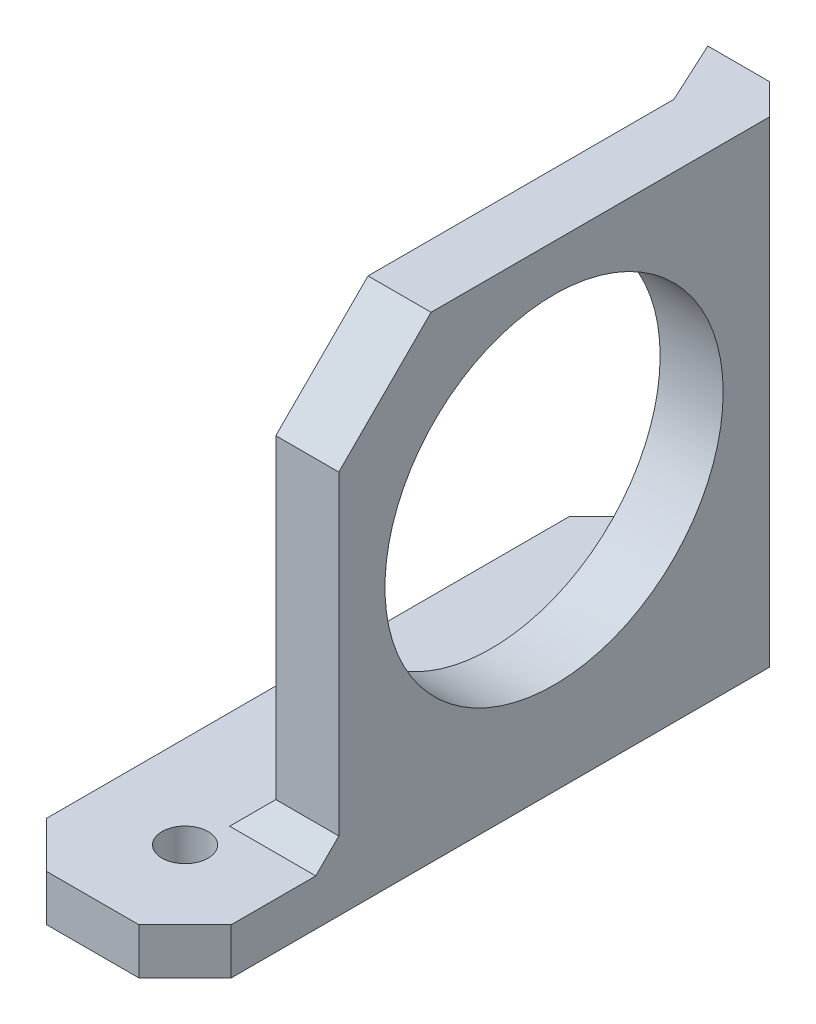
ISO-10303-21;
HEADER;
FILE_DESCRIPTION(('STEP AP214'),'2;1');
FILE_NAME('part.step','',(''),(''),'','','');
FILE_SCHEMA(('AUTOMOTIVE_DESIGN { 1 0 10303 214 1 1 1 1 }'));
ENDSEC;
DATA;
#1=APPLICATION_CONTEXT('core data for automotive mechanical design processes');
#2=APPLICATION_PROTOCOL_DEFINITION('international standard','automotive_design',2000,#1);
#3=PRODUCT_CONTEXT('',#1,'mechanical');
#4=PRODUCT('Part','Part','',(#3));
#5=PRODUCT_RELATED_PRODUCT_CATEGORY('part','',(#4));
#6=PRODUCT_DEFINITION_FORMATION('','',#4);
#7=PRODUCT_DEFINITION_CONTEXT('part definition',#1,'design');
#8=PRODUCT_DEFINITION('design','',#6,#7);
#9=PRODUCT_DEFINITION_SHAPE('','',#8);
#10=(LENGTH_UNIT() NAMED_UNIT(*) SI_UNIT(.MILLI.,.METRE.));
#11=(NAMED_UNIT(*) PLANE_ANGLE_UNIT() SI_UNIT($,.RADIAN.));
#12=(NAMED_UNIT(*) SI_UNIT($,.STERADIAN.) SOLID_ANGLE_UNIT());
#13=UNCERTAINTY_MEASURE_WITH_UNIT(LENGTH_MEASURE(1.E-05),#10,'distance_accuracy_value','');
#14=(GEOMETRIC_REPRESENTATION_CONTEXT(3) GLOBAL_UNCERTAINTY_ASSIGNED_CONTEXT((#13)) GLOBAL_UNIT_ASSIGNED_CONTEXT((#10,
#11,#12)) REPRESENTATION_CONTEXT('',''));
#15=CARTESIAN_POINT('',(0.,0.,0.));
#16=DIRECTION('',(0.,0.,1.));
#17=DIRECTION('',(1.,0.,0.));
#18=AXIS2_PLACEMENT_3D('',#15,#16,#17);
#19=CARTESIAN_POINT('',(0.,3.,0.));
#20=DIRECTION('',(0.,1.,0.));
#21=DIRECTION('',(0.,0.,1.));
#22=AXIS2_PLACEMENT_3D('',#19,#20,#21);
#23=PLANE('',#22);
#24=DIRECTION('',(0.,0.,-1.));
#25=VECTOR('',#24,1.);
#26=CARTESIAN_POINT('',(6.,3.,-20.));
#27=LINE('',#26,#25);
#28=CARTESIAN_POINT('',(6.,3.,17.));
#29=VERTEX_POINT('',#28);
#30=CARTESIAN_POINT('',(6.,3.,11.5));
#31=VERTEX_POINT('',#30);
#32=EDGE_CURVE('E206',#29,#31,#27,.T.);
#33=ORIENTED_EDGE('',*,*,#32,.T.);
#34=DIRECTION('',(-1.,0.,0.));
#35=VECTOR('',#34,1.);
#36=CARTESIAN_POINT('',(1.9,3.,11.5));
#37=LINE('',#36,#35);
#38=CARTESIAN_POINT('',(0.400000000000015,3.,11.5));
#39=VERTEX_POINT('',#38);
#40=EDGE_CURVE('E276',#31,#39,#37,.T.);
#41=ORIENTED_EDGE('',*,*,#40,.T.);
#42=DIRECTION('',(0.,0.,-1.));
#43=VECTOR('',#42,1.);
#44=CARTESIAN_POINT('',(0.400000000000015,3.,-15.9));
#45=LINE('',#44,#43);
#46=CARTESIAN_POINT('',(0.400000000000015,3.,-12.5543167705199));
#47=VERTEX_POINT('',#46);
#48=EDGE_CURVE('E274',#39,#47,#45,.T.);
#49=ORIENTED_EDGE('',*,*,#48,.T.);
#50=CARTESIAN_POINT('',(0.,3.,-14.));
#51=DIRECTION('',(0.,1.,0.));
#52=DIRECTION('',(0.,0.,1.));
#53=AXIS2_PLACEMENT_3D('',#50,#51,#52);
#54=CIRCLE('',#53,1.5);
#55=CARTESIAN_POINT('',(0.400000000000015,3.,-15.4456832294801));
#56=VERTEX_POINT('',#55);
#57=EDGE_CURVE('E200',#56,#47,#54,.T.);
#58=ORIENTED_EDGE('',*,*,#57,.F.);
#59=DIRECTION('',(0.,0.,-1.));
#60=VECTOR('',#59,1.);
#61=CARTESIAN_POINT('',(0.400000000000015,3.,-15.9));
#62=LINE('',#61,#60);
#63=CARTESIAN_POINT('',(0.400000000000014,3.,-19.1368421052631));
#64=VERTEX_POINT('',#63);
#65=EDGE_CURVE('E272',#56,#64,#62,.T.);
#66=ORIENTED_EDGE('',*,*,#65,.T.);
#67=DIRECTION('',(0.420461012783948,0.,0.90731060653378));
#68=VECTOR('',#67,1.);
#69=CARTESIAN_POINT('',(0.,3.,-20.));
#70=LINE('',#69,#68);
#71=CARTESIAN_POINT('',(0.,3.,-20.));
#72=VERTEX_POINT('',#71);
#73=EDGE_CURVE('E186',#72,#64,#70,.T.);
#74=ORIENTED_EDGE('',*,*,#73,.F.);
#75=DIRECTION('',(-1.,0.,0.));
#76=VECTOR('',#75,1.);
#77=CARTESIAN_POINT('',(-3.,3.,-20.));
#78=LINE('',#77,#76);
#79=CARTESIAN_POINT('',(-3.,3.,-20.));
#80=VERTEX_POINT('',#79);
#81=EDGE_CURVE('E175',#72,#80,#78,.T.);
#82=ORIENTED_EDGE('',*,*,#81,.T.);
#83=DIRECTION('',(-0.707106781186548,0.,0.707106781186547));
#84=VECTOR('',#83,1.);
#85=CARTESIAN_POINT('',(-6.,3.,-17.));
#86=LINE('',#85,#84);
#87=CARTESIAN_POINT('',(-6.,3.,-17.));
#88=VERTEX_POINT('',#87);
#89=EDGE_CURVE('E211',#80,#88,#86,.T.);
#90=ORIENTED_EDGE('',*,*,#89,.T.);
#91=DIRECTION('',(0.,0.,1.));
#92=VECTOR('',#91,1.);
#93=CARTESIAN_POINT('',(-6.,3.,-17.));
#94=LINE('',#93,#92);
#95=CARTESIAN_POINT('',(-6.,3.,17.));
#96=VERTEX_POINT('',#95);
#97=EDGE_CURVE('E213',#88,#96,#94,.T.);
#98=ORIENTED_EDGE('',*,*,#97,.T.);
#99=DIRECTION('',(0.707106781186547,0.,0.707106781186548));
#100=VECTOR('',#99,1.);
#101=CARTESIAN_POINT('',(-6.,3.,17.));
#102=LINE('',#101,#100);
#103=CARTESIAN_POINT('',(-3.,3.,20.));
#104=VERTEX_POINT('',#103);
#105=EDGE_CURVE('E215',#96,#104,#102,.T.);
#106=ORIENTED_EDGE('',*,*,#105,.T.);
#107=DIRECTION('',(1.,0.,0.));
#108=VECTOR('',#107,1.);
#109=CARTESIAN_POINT('',(-3.,3.,20.));
#110=LINE('',#109,#108);
#111=CARTESIAN_POINT('',(3.,3.,20.));
#112=VERTEX_POINT('',#111);
#113=EDGE_CURVE('E217',#104,#112,#110,.T.);
#114=ORIENTED_EDGE('',*,*,#113,.T.);
#115=DIRECTION('',(0.707106781186547,0.,-0.707106781186548));
#116=VECTOR('',#115,1.);
#117=CARTESIAN_POINT('',(3.,3.,20.));
#118=LINE('',#117,#116);
#119=EDGE_CURVE('E219',#112,#29,#118,.T.);
#120=ORIENTED_EDGE('',*,*,#119,.T.);
#121=EDGE_LOOP('',(#33,#41,#49,#58,#66,#74,#82,#90,#98,#106,#114,#120));
#122=FACE_BOUND('',#121,.T.);
#123=CARTESIAN_POINT('',(0.,3.,14.));
#124=DIRECTION('',(0.,1.,0.));
#125=DIRECTION('',(0.,0.,1.));
#126=AXIS2_PLACEMENT_3D('',#123,#124,#125);
#127=CIRCLE('',#126,1.5);
#128=CARTESIAN_POINT('',(0.,3.,15.5));
#129=VERTEX_POINT('',#128);
#130=EDGE_CURVE('E194',#129,#129,#127,.T.);
#131=ORIENTED_EDGE('',*,*,#130,.F.);
#132=EDGE_LOOP('',(#131));
#133=FACE_BOUND('',#132,.T.);
#134=ADVANCED_FACE('F43',(#122,#133),#23,.T.);
#135=CARTESIAN_POINT('',(0.,0.,0.));
#136=DIRECTION('',(0.,1.,0.));
#137=DIRECTION('',(0.,0.,1.));
#138=AXIS2_PLACEMENT_3D('',#135,#136,#137);
#139=PLANE('',#138);
#140=DIRECTION('',(-1.,0.,0.));
#141=VECTOR('',#140,1.);
#142=CARTESIAN_POINT('',(-3.,0.,-20.));
#143=LINE('',#142,#141);
#144=CARTESIAN_POINT('',(3.99999999999999,0.,-20.));
#145=VERTEX_POINT('',#144);
#146=CARTESIAN_POINT('',(-3.,0.,-20.));
#147=VERTEX_POINT('',#146);
#148=EDGE_CURVE('E224',#145,#147,#143,.T.);
#149=ORIENTED_EDGE('',*,*,#148,.F.);
#150=DIRECTION('',(-0.707106781186547,0.,-0.707106781186548));
#151=VECTOR('',#150,1.);
#152=CARTESIAN_POINT('',(4.,0.,-20.));
#153=LINE('',#152,#151);
#154=CARTESIAN_POINT('',(6.,0.,-18.));
#155=VERTEX_POINT('',#154);
#156=EDGE_CURVE('E254',#145,#155,#153,.F.);
#157=ORIENTED_EDGE('',*,*,#156,.T.);
#158=DIRECTION('',(0.,0.,-1.));
#159=VECTOR('',#158,1.);
#160=CARTESIAN_POINT('',(6.,0.,-20.));
#161=LINE('',#160,#159);
#162=CARTESIAN_POINT('',(6.,0.,17.));
#163=VERTEX_POINT('',#162);
#164=EDGE_CURVE('E203',#163,#155,#161,.T.);
#165=ORIENTED_EDGE('',*,*,#164,.F.);
#166=DIRECTION('',(0.707106781186547,0.,-0.707106781186548));
#167=VECTOR('',#166,1.);
#168=CARTESIAN_POINT('',(3.,0.,20.));
#169=LINE('',#168,#167);
#170=CARTESIAN_POINT('',(3.,0.,20.));
#171=VERTEX_POINT('',#170);
#172=EDGE_CURVE('E209',#171,#163,#169,.T.);
#173=ORIENTED_EDGE('',*,*,#172,.F.);
#174=DIRECTION('',(1.,0.,0.));
#175=VECTOR('',#174,1.);
#176=CARTESIAN_POINT('',(-3.,0.,20.));
#177=LINE('',#176,#175);
#178=CARTESIAN_POINT('',(-3.,0.,20.));
#179=VERTEX_POINT('',#178);
#180=EDGE_CURVE('E232',#179,#171,#177,.T.);
#181=ORIENTED_EDGE('',*,*,#180,.F.);
#182=DIRECTION('',(0.707106781186547,0.,0.707106781186548));
#183=VECTOR('',#182,1.);
#184=CARTESIAN_POINT('',(-6.,0.,17.));
#185=LINE('',#184,#183);
#186=CARTESIAN_POINT('',(-6.,0.,17.));
#187=VERTEX_POINT('',#186);
#188=EDGE_CURVE('E230',#187,#179,#185,.T.);
#189=ORIENTED_EDGE('',*,*,#188,.F.);
#190=DIRECTION('',(0.,0.,1.));
#191=VECTOR('',#190,1.);
#192=CARTESIAN_POINT('',(-6.,0.,-17.));
#193=LINE('',#192,#191);
#194=CARTESIAN_POINT('',(-6.,0.,-17.));
#195=VERTEX_POINT('',#194);
#196=EDGE_CURVE('E228',#195,#187,#193,.T.);
#197=ORIENTED_EDGE('',*,*,#196,.F.);
#198=DIRECTION('',(-0.707106781186548,0.,0.707106781186547));
#199=VECTOR('',#198,1.);
#200=CARTESIAN_POINT('',(-6.,0.,-17.));
#201=LINE('',#200,#199);
#202=EDGE_CURVE('E226',#147,#195,#201,.T.);
#203=ORIENTED_EDGE('',*,*,#202,.F.);
#204=EDGE_LOOP('',(#149,#157,#165,#173,#181,#189,#197,#203));
#205=FACE_BOUND('',#204,.T.);
#206=CARTESIAN_POINT('',(0.,0.,-14.));
#207=DIRECTION('',(0.,1.,0.));
#208=DIRECTION('',(0.,0.,1.));
#209=AXIS2_PLACEMENT_3D('',#206,#207,#208);
#210=CIRCLE('',#209,1.5);
#211=CARTESIAN_POINT('',(0.,0.,-12.5));
#212=VERTEX_POINT('',#211);
#213=EDGE_CURVE('E197',#212,#212,#210,.T.);
#214=ORIENTED_EDGE('',*,*,#213,.T.);
#215=EDGE_LOOP('',(#214));
#216=FACE_BOUND('',#215,.T.);
#217=CARTESIAN_POINT('',(0.,0.,14.));
#218=DIRECTION('',(0.,1.,0.));
#219=DIRECTION('',(0.,0.,1.));
#220=AXIS2_PLACEMENT_3D('',#217,#218,#219);
#221=CIRCLE('',#220,1.5);
#222=CARTESIAN_POINT('',(0.,0.,15.5));
#223=VERTEX_POINT('',#222);
#224=EDGE_CURVE('E176',#223,#223,#221,.T.);
#225=ORIENTED_EDGE('',*,*,#224,.T.);
#226=EDGE_LOOP('',(#225));
#227=FACE_BOUND('',#226,.T.);
#228=ADVANCED_FACE('F312',(#205,#216,#227),#139,.F.);
#229=CARTESIAN_POINT('',(6.,3.,-20.));
#230=DIRECTION('',(-1.,0.,0.));
#231=DIRECTION('',(0.,0.,1.));
#232=AXIS2_PLACEMENT_3D('',#229,#230,#231);
#233=PLANE('',#232);
#234=CARTESIAN_POINT('',(6.,17.,-4.));
#235=DIRECTION('',(1.,0.,0.));
#236=DIRECTION('',(0.,0.,-1.));
#237=AXIS2_PLACEMENT_3D('',#234,#235,#236);
#238=CIRCLE('',#237,11.);
#239=CARTESIAN_POINT('',(6.,17.,-15.));
#240=VERTEX_POINT('',#239);
#241=EDGE_CURVE('E263',#240,#240,#238,.T.);
#242=ORIENTED_EDGE('',*,*,#241,.F.);
#243=EDGE_LOOP('',(#242));
#244=FACE_BOUND('',#243,.T.);
#245=DIRECTION('',(0.,0.,-1.));
#246=VECTOR('',#245,1.);
#247=CARTESIAN_POINT('',(6.,31.,10.));
#248=LINE('',#247,#246);
#249=CARTESIAN_POINT('',(6.,31.,3.99999999999998));
#250=VERTEX_POINT('',#249);
#251=CARTESIAN_POINT('',(6.,31.,-18.));
#252=VERTEX_POINT('',#251);
#253=EDGE_CURVE('E168',#250,#252,#248,.T.);
#254=ORIENTED_EDGE('',*,*,#253,.F.);
#255=DIRECTION('',(0.,0.707106781186548,-0.707106781186548));
#256=VECTOR('',#255,1.);
#257=CARTESIAN_POINT('',(6.,25.,10.));
#258=LINE('',#257,#256);
#259=CARTESIAN_POINT('',(6.,25.,10.));
#260=VERTEX_POINT('',#259);
#261=EDGE_CURVE('E270',#250,#260,#258,.F.);
#262=ORIENTED_EDGE('',*,*,#261,.T.);
#263=DIRECTION('',(0.,-1.,0.));
#264=VECTOR('',#263,1.);
#265=CARTESIAN_POINT('',(6.,31.,10.));
#266=LINE('',#265,#264);
#267=CARTESIAN_POINT('',(6.,4.49999999999999,10.));
#268=VERTEX_POINT('',#267);
#269=EDGE_CURVE('E182',#260,#268,#266,.T.);
#270=ORIENTED_EDGE('',*,*,#269,.T.);
#271=DIRECTION('',(0.,0.707106781186547,-0.707106781186548));
#272=VECTOR('',#271,1.);
#273=CARTESIAN_POINT('',(6.,18.75,-4.25000000000002));
#274=LINE('',#273,#272);
#275=EDGE_CURVE('E53',#268,#31,#274,.F.);
#276=ORIENTED_EDGE('',*,*,#275,.T.);
#277=ORIENTED_EDGE('',*,*,#32,.F.);
#278=DIRECTION('',(0.,-1.,0.));
#279=VECTOR('',#278,1.);
#280=CARTESIAN_POINT('',(6.,3.,17.));
#281=LINE('',#280,#279);
#282=EDGE_CURVE('E221',#29,#163,#281,.T.);
#283=ORIENTED_EDGE('',*,*,#282,.T.);
#284=ORIENTED_EDGE('',*,*,#164,.T.);
#285=DIRECTION('',(0.,1.,0.));
#286=VECTOR('',#285,1.);
#287=CARTESIAN_POINT('',(6.,3.,-18.));
#288=LINE('',#287,#286);
#289=EDGE_CURVE('E256',#155,#252,#288,.T.);
#290=ORIENTED_EDGE('',*,*,#289,.T.);
#291=EDGE_LOOP('',(#254,#262,#270,#276,#277,#283,#284,#290));
#292=FACE_BOUND('',#291,.T.);
#293=ADVANCED_FACE('F287',(#244,#292),#233,.F.);
#294=CARTESIAN_POINT('',(-3.,3.,-20.));
#295=DIRECTION('',(0.,0.,1.));
#296=DIRECTION('',(1.,0.,0.));
#297=AXIS2_PLACEMENT_3D('',#294,#295,#296);
#298=PLANE('',#297);
#299=DIRECTION('',(-1.,0.,0.));
#300=VECTOR('',#299,1.);
#301=CARTESIAN_POINT('',(6.,31.,-20.));
#302=LINE('',#301,#300);
#303=CARTESIAN_POINT('',(3.99999999999999,31.,-20.));
#304=VERTEX_POINT('',#303);
#305=CARTESIAN_POINT('',(0.,31.,-20.));
#306=VERTEX_POINT('',#305);
#307=EDGE_CURVE('E157',#304,#306,#302,.T.);
#308=ORIENTED_EDGE('',*,*,#307,.F.);
#309=DIRECTION('',(0.,-1.,0.));
#310=VECTOR('',#309,1.);
#311=CARTESIAN_POINT('',(3.99999999999999,3.,-20.));
#312=LINE('',#311,#310);
#313=EDGE_CURVE('E252',#304,#145,#312,.T.);
#314=ORIENTED_EDGE('',*,*,#313,.T.);
#315=ORIENTED_EDGE('',*,*,#148,.T.);
#316=DIRECTION('',(0.,-1.,0.));
#317=VECTOR('',#316,1.);
#318=CARTESIAN_POINT('',(-3.,3.,-20.));
#319=LINE('',#318,#317);
#320=EDGE_CURVE('E249',#80,#147,#319,.T.);
#321=ORIENTED_EDGE('',*,*,#320,.F.);
#322=ORIENTED_EDGE('',*,*,#81,.F.);
#323=DIRECTION('',(0.,-1.,0.));
#324=VECTOR('',#323,1.);
#325=CARTESIAN_POINT('',(0.,31.,-20.));
#326=LINE('',#325,#324);
#327=EDGE_CURVE('E172',#306,#72,#326,.T.);
#328=ORIENTED_EDGE('',*,*,#327,.F.);
#329=EDGE_LOOP('',(#308,#314,#315,#321,#322,#328));
#330=FACE_BOUND('',#329,.T.);
#331=ADVANCED_FACE('F173',(#330),#298,.F.);
#332=CARTESIAN_POINT('',(-6.,3.,-17.));
#333=DIRECTION('',(0.707106781186547,0.,0.707106781186548));
#334=DIRECTION('',(0.707106781186548,0.,-0.707106781186547));
#335=AXIS2_PLACEMENT_3D('',#332,#333,#334);
#336=PLANE('',#335);
#337=ORIENTED_EDGE('',*,*,#202,.T.);
#338=DIRECTION('',(0.,-1.,0.));
#339=VECTOR('',#338,1.);
#340=CARTESIAN_POINT('',(-6.,3.,-17.));
#341=LINE('',#340,#339);
#342=EDGE_CURVE('E246',#88,#195,#341,.T.);
#343=ORIENTED_EDGE('',*,*,#342,.F.);
#344=ORIENTED_EDGE('',*,*,#89,.F.);
#345=ORIENTED_EDGE('',*,*,#320,.T.);
#346=EDGE_LOOP('',(#337,#343,#344,#345));
#347=FACE_BOUND('',#346,.T.);
#348=ADVANCED_FACE('F348',(#347),#336,.F.);
#349=CARTESIAN_POINT('',(-6.,3.,-17.));
#350=DIRECTION('',(1.,0.,0.));
#351=DIRECTION('',(0.,0.,-1.));
#352=AXIS2_PLACEMENT_3D('',#349,#350,#351);
#353=PLANE('',#352);
#354=ORIENTED_EDGE('',*,*,#196,.T.);
#355=DIRECTION('',(0.,-1.,0.));
#356=VECTOR('',#355,1.);
#357=CARTESIAN_POINT('',(-6.,3.,17.));
#358=LINE('',#357,#356);
#359=EDGE_CURVE('E243',#96,#187,#358,.T.);
#360=ORIENTED_EDGE('',*,*,#359,.F.);
#361=ORIENTED_EDGE('',*,*,#97,.F.);
#362=ORIENTED_EDGE('',*,*,#342,.T.);
#363=EDGE_LOOP('',(#354,#360,#361,#362));
#364=FACE_BOUND('',#363,.T.);
#365=ADVANCED_FACE('F344',(#364),#353,.F.);
#366=CARTESIAN_POINT('',(-6.,3.,17.));
#367=DIRECTION('',(0.707106781186548,0.,-0.707106781186547));
#368=DIRECTION('',(-0.707106781186547,0.,-0.707106781186548));
#369=AXIS2_PLACEMENT_3D('',#366,#367,#368);
#370=PLANE('',#369);
#371=ORIENTED_EDGE('',*,*,#188,.T.);
#372=DIRECTION('',(0.,-1.,0.));
#373=VECTOR('',#372,1.);
#374=CARTESIAN_POINT('',(-3.,3.,20.));
#375=LINE('',#374,#373);
#376=EDGE_CURVE('E240',#104,#179,#375,.T.);
#377=ORIENTED_EDGE('',*,*,#376,.F.);
#378=ORIENTED_EDGE('',*,*,#105,.F.);
#379=ORIENTED_EDGE('',*,*,#359,.T.);
#380=EDGE_LOOP('',(#371,#377,#378,#379));
#381=FACE_BOUND('',#380,.T.);
#382=ADVANCED_FACE('F340',(#381),#370,.F.);
#383=CARTESIAN_POINT('',(-3.,3.,20.));
#384=DIRECTION('',(0.,0.,-1.));
#385=DIRECTION('',(-1.,0.,0.));
#386=AXIS2_PLACEMENT_3D('',#383,#384,#385);
#387=PLANE('',#386);
#388=ORIENTED_EDGE('',*,*,#180,.T.);
#389=DIRECTION('',(0.,-1.,0.));
#390=VECTOR('',#389,1.);
#391=CARTESIAN_POINT('',(3.,3.,20.));
#392=LINE('',#391,#390);
#393=EDGE_CURVE('E237',#112,#171,#392,.T.);
#394=ORIENTED_EDGE('',*,*,#393,.F.);
#395=ORIENTED_EDGE('',*,*,#113,.F.);
#396=ORIENTED_EDGE('',*,*,#376,.T.);
#397=EDGE_LOOP('',(#388,#394,#395,#396));
#398=FACE_BOUND('',#397,.T.);
#399=ADVANCED_FACE('F336',(#398),#387,.F.);
#400=CARTESIAN_POINT('',(3.,3.,20.));
#401=DIRECTION('',(-0.707106781186548,0.,-0.707106781186547));
#402=DIRECTION('',(-0.707106781186547,0.,0.707106781186548));
#403=AXIS2_PLACEMENT_3D('',#400,#401,#402);
#404=PLANE('',#403);
#405=ORIENTED_EDGE('',*,*,#172,.T.);
#406=ORIENTED_EDGE('',*,*,#282,.F.);
#407=ORIENTED_EDGE('',*,*,#119,.F.);
#408=ORIENTED_EDGE('',*,*,#393,.T.);
#409=EDGE_LOOP('',(#405,#406,#407,#408));
#410=FACE_BOUND('',#409,.T.);
#411=ADVANCED_FACE('F308',(#410),#404,.F.);
#412=CARTESIAN_POINT('',(0.,3.,-14.));
#413=DIRECTION('',(0.,-1.,0.));
#414=DIRECTION('',(0.,0.,-1.));
#415=AXIS2_PLACEMENT_3D('',#412,#413,#414);
#416=CYLINDRICAL_SURFACE('',#415,1.5);
#417=ORIENTED_EDGE('',*,*,#57,.T.);
#418=CARTESIAN_POINT('',(0.,2.59999999999999,-14.));
#419=DIRECTION('',(-0.707106781186547,0.707106781186548,0.));
#420=DIRECTION('',(-0.707106781186548,-0.707106781186547,0.));
#421=AXIS2_PLACEMENT_3D('',#418,#419,#420);
#422=ELLIPSE('',#421,2.12132034355964,1.5);
#423=EDGE_CURVE('E11',#47,#56,#422,.T.);
#424=ORIENTED_EDGE('',*,*,#423,.T.);
#425=EDGE_LOOP('',(#417,#424));
#426=FACE_BOUND('',#425,.T.);
#427=ORIENTED_EDGE('',*,*,#213,.F.);
#428=EDGE_LOOP('',(#427));
#429=FACE_BOUND('',#428,.T.);
#430=ADVANCED_FACE('F304',(#426,#429),#416,.F.);
#431=CARTESIAN_POINT('',(0.,3.,14.));
#432=DIRECTION('',(0.,-1.,0.));
#433=DIRECTION('',(0.,0.,-1.));
#434=AXIS2_PLACEMENT_3D('',#431,#432,#433);
#435=CYLINDRICAL_SURFACE('',#434,1.5);
#436=ORIENTED_EDGE('',*,*,#130,.T.);
#437=EDGE_LOOP('',(#436));
#438=FACE_BOUND('',#437,.T.);
#439=ORIENTED_EDGE('',*,*,#224,.F.);
#440=EDGE_LOOP('',(#439));
#441=FACE_BOUND('',#440,.T.);
#442=ADVANCED_FACE('F307',(#438,#441),#435,.F.);
#443=CARTESIAN_POINT('',(0.,31.,-20.));
#444=DIRECTION('',(0.90731060653378,0.,-0.420461012783948));
#445=DIRECTION('',(-0.420461012783948,0.,-0.907310606533781));
#446=AXIS2_PLACEMENT_3D('',#443,#444,#445);
#447=PLANE('',#446);
#448=ORIENTED_EDGE('',*,*,#73,.T.);
#449=DIRECTION('',(-0.387593705529334,-0.387593705529334,-0.836386417194876));
#450=VECTOR('',#449,1.);
#451=CARTESIAN_POINT('',(6.60374531835207,9.20374531835206,-5.74981273408241));
#452=LINE('',#451,#450);
#453=CARTESIAN_POINT('',(1.9,4.49999999999999,-15.9));
#454=VERTEX_POINT('',#453);
#455=EDGE_CURVE('E60',#64,#454,#452,.F.);
#456=ORIENTED_EDGE('',*,*,#455,.T.);
#457=DIRECTION('',(0.,-1.,0.));
#458=VECTOR('',#457,1.);
#459=CARTESIAN_POINT('',(1.9,31.,-15.9));
#460=LINE('',#459,#458);
#461=CARTESIAN_POINT('',(1.9,31.,-15.9));
#462=VERTEX_POINT('',#461);
#463=EDGE_CURVE('E177',#462,#454,#460,.T.);
#464=ORIENTED_EDGE('',*,*,#463,.F.);
#465=DIRECTION('',(0.420461012783948,0.,0.90731060653378));
#466=VECTOR('',#465,1.);
#467=CARTESIAN_POINT('',(0.,31.,-20.));
#468=LINE('',#467,#466);
#469=EDGE_CURVE('E162',#306,#462,#468,.T.);
#470=ORIENTED_EDGE('',*,*,#469,.F.);
#471=ORIENTED_EDGE('',*,*,#327,.T.);
#472=EDGE_LOOP('',(#448,#456,#464,#470,#471));
#473=FACE_BOUND('',#472,.T.);
#474=ADVANCED_FACE('F179',(#473),#447,.F.);
#475=CARTESIAN_POINT('',(1.9,31.,10.));
#476=DIRECTION('',(-1.,0.,0.));
#477=DIRECTION('',(0.,0.,1.));
#478=AXIS2_PLACEMENT_3D('',#475,#476,#477);
#479=PLANE('',#478);
#480=CARTESIAN_POINT('',(1.9,17.,-4.));
#481=DIRECTION('',(-1.,0.,0.));
#482=DIRECTION('',(0.,0.,1.));
#483=AXIS2_PLACEMENT_3D('',#480,#481,#482);
#484=CIRCLE('',#483,11.);
#485=CARTESIAN_POINT('',(1.9,17.,7.));
#486=VERTEX_POINT('',#485);
#487=EDGE_CURVE('E188',#486,#486,#484,.T.);
#488=ORIENTED_EDGE('',*,*,#487,.F.);
#489=EDGE_LOOP('',(#488));
#490=FACE_BOUND('',#489,.T.);
#491=ORIENTED_EDGE('',*,*,#463,.T.);
#492=DIRECTION('',(0.,0.,1.));
#493=VECTOR('',#492,1.);
#494=CARTESIAN_POINT('',(1.9,4.49999999999999,10.));
#495=LINE('',#494,#493);
#496=CARTESIAN_POINT('',(1.9,4.49999999999999,10.));
#497=VERTEX_POINT('',#496);
#498=EDGE_CURVE('E67',#454,#497,#495,.T.);
#499=ORIENTED_EDGE('',*,*,#498,.T.);
#500=DIRECTION('',(0.,-1.,0.));
#501=VECTOR('',#500,1.);
#502=CARTESIAN_POINT('',(1.9,31.,10.));
#503=LINE('',#502,#501);
#504=CARTESIAN_POINT('',(1.9,25.,10.));
#505=VERTEX_POINT('',#504);
#506=EDGE_CURVE('E191',#505,#497,#503,.T.);
#507=ORIENTED_EDGE('',*,*,#506,.F.);
#508=DIRECTION('',(0.,-0.707106781186547,0.707106781186547));
#509=VECTOR('',#508,1.);
#510=CARTESIAN_POINT('',(1.9,28.,6.99999999999999));
#511=LINE('',#510,#509);
#512=CARTESIAN_POINT('',(1.9,31.,3.99999999999998));
#513=VERTEX_POINT('',#512);
#514=EDGE_CURVE('E266',#505,#513,#511,.F.);
#515=ORIENTED_EDGE('',*,*,#514,.T.);
#516=DIRECTION('',(0.,0.,-1.));
#517=VECTOR('',#516,1.);
#518=CARTESIAN_POINT('',(1.9,31.,10.));
#519=LINE('',#518,#517);
#520=EDGE_CURVE('E180',#513,#462,#519,.T.);
#521=ORIENTED_EDGE('',*,*,#520,.T.);
#522=EDGE_LOOP('',(#491,#499,#507,#515,#521));
#523=FACE_BOUND('',#522,.T.);
#524=ADVANCED_FACE('F326',(#490,#523),#479,.T.);
#525=CARTESIAN_POINT('',(6.,31.,10.));
#526=DIRECTION('',(0.,0.,1.));
#527=DIRECTION('',(1.,0.,0.));
#528=AXIS2_PLACEMENT_3D('',#525,#526,#527);
#529=PLANE('',#528);
#530=ORIENTED_EDGE('',*,*,#506,.T.);
#531=DIRECTION('',(1.,0.,0.));
#532=VECTOR('',#531,1.);
#533=CARTESIAN_POINT('',(6.,4.49999999999999,10.));
#534=LINE('',#533,#532);
#535=EDGE_CURVE('E279',#497,#268,#534,.T.);
#536=ORIENTED_EDGE('',*,*,#535,.T.);
#537=ORIENTED_EDGE('',*,*,#269,.F.);
#538=DIRECTION('',(-1.,0.,0.));
#539=VECTOR('',#538,1.);
#540=CARTESIAN_POINT('',(6.,25.,10.));
#541=LINE('',#540,#539);
#542=EDGE_CURVE('E260',#260,#505,#541,.T.);
#543=ORIENTED_EDGE('',*,*,#542,.T.);
#544=EDGE_LOOP('',(#530,#536,#537,#543));
#545=FACE_BOUND('',#544,.T.);
#546=ADVANCED_FACE('F384',(#545),#529,.T.);
#547=CARTESIAN_POINT('',(0.,31.,0.));
#548=DIRECTION('',(0.,1.,0.));
#549=DIRECTION('',(0.,0.,1.));
#550=AXIS2_PLACEMENT_3D('',#547,#548,#549);
#551=PLANE('',#550);
#552=ORIENTED_EDGE('',*,*,#520,.F.);
#553=DIRECTION('',(1.,0.,0.));
#554=VECTOR('',#553,1.);
#555=CARTESIAN_POINT('',(0.,31.,3.99999999999998));
#556=LINE('',#555,#554);
#557=EDGE_CURVE('E268',#513,#250,#556,.T.);
#558=ORIENTED_EDGE('',*,*,#557,.T.);
#559=ORIENTED_EDGE('',*,*,#253,.T.);
#560=DIRECTION('',(0.707106781186547,0.,0.707106781186548));
#561=VECTOR('',#560,1.);
#562=CARTESIAN_POINT('',(12.,31.,-12.));
#563=LINE('',#562,#561);
#564=EDGE_CURVE('E164',#252,#304,#563,.F.);
#565=ORIENTED_EDGE('',*,*,#564,.T.);
#566=ORIENTED_EDGE('',*,*,#307,.T.);
#567=ORIENTED_EDGE('',*,*,#469,.T.);
#568=EDGE_LOOP('',(#552,#558,#559,#565,#566,#567));
#569=FACE_BOUND('',#568,.T.);
#570=ADVANCED_FACE('F160',(#569),#551,.T.);
#571=CARTESIAN_POINT('',(4.,3.,-20.));
#572=DIRECTION('',(-0.707106781186548,0.,0.707106781186547));
#573=DIRECTION('',(0.,-1.,0.));
#574=AXIS2_PLACEMENT_3D('',#571,#572,#573);
#575=PLANE('',#574);
#576=ORIENTED_EDGE('',*,*,#564,.F.);
#577=ORIENTED_EDGE('',*,*,#289,.F.);
#578=ORIENTED_EDGE('',*,*,#156,.F.);
#579=ORIENTED_EDGE('',*,*,#313,.F.);
#580=EDGE_LOOP('',(#576,#577,#578,#579));
#581=FACE_BOUND('',#580,.T.);
#582=ADVANCED_FACE('F358',(#581),#575,.F.);
#583=CARTESIAN_POINT('',(-5.,17.,-4.));
#584=DIRECTION('',(1.,0.,0.));
#585=DIRECTION('',(0.,0.,-1.));
#586=AXIS2_PLACEMENT_3D('',#583,#584,#585);
#587=CYLINDRICAL_SURFACE('',#586,11.);
#588=ORIENTED_EDGE('',*,*,#487,.T.);
#589=EDGE_LOOP('',(#588));
#590=FACE_BOUND('',#589,.T.);
#591=ORIENTED_EDGE('',*,*,#241,.T.);
#592=EDGE_LOOP('',(#591));
#593=FACE_BOUND('',#592,.T.);
#594=ADVANCED_FACE('F364',(#590,#593),#587,.F.);
#595=CARTESIAN_POINT('',(6.,25.,10.));
#596=DIRECTION('',(0.,-0.707106781186547,-0.707106781186547));
#597=DIRECTION('',(-1.,0.,0.));
#598=AXIS2_PLACEMENT_3D('',#595,#596,#597);
#599=PLANE('',#598);
#600=ORIENTED_EDGE('',*,*,#261,.F.);
#601=ORIENTED_EDGE('',*,*,#557,.F.);
#602=ORIENTED_EDGE('',*,*,#514,.F.);
#603=ORIENTED_EDGE('',*,*,#542,.F.);
#604=EDGE_LOOP('',(#600,#601,#602,#603));
#605=FACE_BOUND('',#604,.T.);
#606=ADVANCED_FACE('F366',(#605),#599,.F.);
#607=CARTESIAN_POINT('',(0.400000000000015,3.,0.));
#608=DIRECTION('',(-0.707106781186547,0.707106781186548,0.));
#609=DIRECTION('',(0.,0.,1.));
#610=AXIS2_PLACEMENT_3D('',#607,#608,#609);
#611=PLANE('',#610);
#612=ORIENTED_EDGE('',*,*,#423,.F.);
#613=ORIENTED_EDGE('',*,*,#48,.F.);
#614=DIRECTION('',(0.577350269189626,0.577350269189626,-0.577350269189626));
#615=VECTOR('',#614,1.);
#616=CARTESIAN_POINT('',(4.23333333333334,6.83333333333333,7.66666666666665));
#617=LINE('',#616,#615);
#618=EDGE_CURVE('E48',#497,#39,#617,.F.);
#619=ORIENTED_EDGE('',*,*,#618,.F.);
#620=ORIENTED_EDGE('',*,*,#498,.F.);
#621=ORIENTED_EDGE('',*,*,#455,.F.);
#622=ORIENTED_EDGE('',*,*,#65,.F.);
#623=EDGE_LOOP('',(#612,#613,#619,#620,#621,#622));
#624=FACE_BOUND('',#623,.T.);
#625=ADVANCED_FACE('F46',(#624),#611,.T.);
#626=CARTESIAN_POINT('',(0.,3.,11.5));
#627=DIRECTION('',(0.,0.707106781186548,0.707106781186547));
#628=DIRECTION('',(1.,0.,0.));
#629=AXIS2_PLACEMENT_3D('',#626,#627,#628);
#630=PLANE('',#629);
#631=ORIENTED_EDGE('',*,*,#275,.F.);
#632=ORIENTED_EDGE('',*,*,#535,.F.);
#633=ORIENTED_EDGE('',*,*,#618,.T.);
#634=ORIENTED_EDGE('',*,*,#40,.F.);
#635=EDGE_LOOP('',(#631,#632,#633,#634));
#636=FACE_BOUND('',#635,.T.);
#637=ADVANCED_FACE('F296',(#636),#630,.T.);
#638=CLOSED_SHELL('',(#134,#228,#293,#331,#348,#365,#382,#399,#411,#430,#442,#474,#524,#546,
#570,#582,#594,#606,#625,#637));
#639=MANIFOLD_SOLID_BREP('B2',#638);
#640=ADVANCED_BREP_SHAPE_REPRESENTATION('',(#18,#639),#14);
#641=SHAPE_DEFINITION_REPRESENTATION(#9,#640);
ENDSEC;
END-ISO-10303-21;
